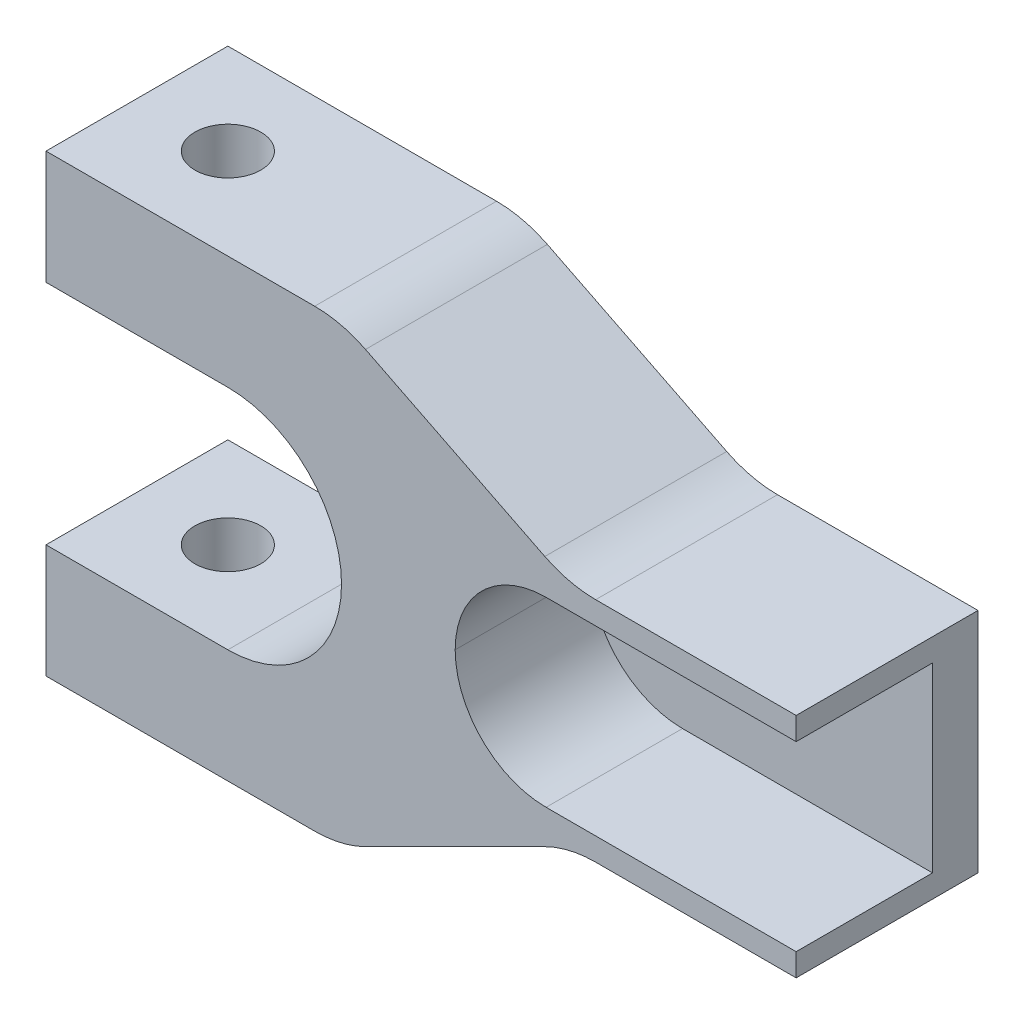
ISO-10303-21;
HEADER;
FILE_DESCRIPTION(('STEP AP214'),'2;1');
FILE_NAME('part.step','',(''),(''),'','','');
FILE_SCHEMA(('AUTOMOTIVE_DESIGN { 1 0 10303 214 1 1 1 1 }'));
ENDSEC;
DATA;
#1=APPLICATION_CONTEXT('core data for automotive mechanical design processes');
#2=APPLICATION_PROTOCOL_DEFINITION('international standard','automotive_design',2000,#1);
#3=PRODUCT_CONTEXT('',#1,'mechanical');
#4=PRODUCT('Part','Part','',(#3));
#5=PRODUCT_RELATED_PRODUCT_CATEGORY('part','',(#4));
#6=PRODUCT_DEFINITION_FORMATION('','',#4);
#7=PRODUCT_DEFINITION_CONTEXT('part definition',#1,'design');
#8=PRODUCT_DEFINITION('design','',#6,#7);
#9=PRODUCT_DEFINITION_SHAPE('','',#8);
#10=(LENGTH_UNIT() NAMED_UNIT(*) SI_UNIT(.MILLI.,.METRE.));
#11=(NAMED_UNIT(*) PLANE_ANGLE_UNIT() SI_UNIT($,.RADIAN.));
#12=(NAMED_UNIT(*) SI_UNIT($,.STERADIAN.) SOLID_ANGLE_UNIT());
#13=UNCERTAINTY_MEASURE_WITH_UNIT(LENGTH_MEASURE(1.E-05),#10,'distance_accuracy_value','');
#14=(GEOMETRIC_REPRESENTATION_CONTEXT(3) GLOBAL_UNCERTAINTY_ASSIGNED_CONTEXT((#13)) GLOBAL_UNIT_ASSIGNED_CONTEXT((#10,
#11,#12)) REPRESENTATION_CONTEXT('',''));
#15=CARTESIAN_POINT('',(0.,0.,0.));
#16=DIRECTION('',(0.,0.,1.));
#17=DIRECTION('',(1.,0.,0.));
#18=AXIS2_PLACEMENT_3D('',#15,#16,#17);
#19=CARTESIAN_POINT('',(-18.,5.,-4.));
#20=DIRECTION('',(-1.,0.,0.));
#21=DIRECTION('',(0.,-1.,0.));
#22=AXIS2_PLACEMENT_3D('',#19,#20,#21);
#23=PLANE('',#22);
#24=DIRECTION('',(0.,-1.,0.));
#25=VECTOR('',#24,1.);
#26=CARTESIAN_POINT('',(-18.,5.,4.));
#27=LINE('',#26,#25);
#28=CARTESIAN_POINT('',(-18.,10.,4.));
#29=VERTEX_POINT('',#28);
#30=CARTESIAN_POINT('',(-18.,5.,4.));
#31=VERTEX_POINT('',#30);
#32=EDGE_CURVE('E399',#29,#31,#27,.T.);
#33=ORIENTED_EDGE('',*,*,#32,.F.);
#34=DIRECTION('',(0.,0.,1.));
#35=VECTOR('',#34,1.);
#36=CARTESIAN_POINT('',(-18.,10.,-4.));
#37=LINE('',#36,#35);
#38=CARTESIAN_POINT('',(-18.,10.,-4.));
#39=VERTEX_POINT('',#38);
#40=EDGE_CURVE('E239',#39,#29,#37,.T.);
#41=ORIENTED_EDGE('',*,*,#40,.F.);
#42=DIRECTION('',(0.,-1.,0.));
#43=VECTOR('',#42,1.);
#44=CARTESIAN_POINT('',(-18.,5.,-4.));
#45=LINE('',#44,#43);
#46=CARTESIAN_POINT('',(-18.,5.,-4.));
#47=VERTEX_POINT('',#46);
#48=EDGE_CURVE('E238',#39,#47,#45,.T.);
#49=ORIENTED_EDGE('',*,*,#48,.T.);
#50=DIRECTION('',(0.,0.,1.));
#51=VECTOR('',#50,1.);
#52=CARTESIAN_POINT('',(-18.,5.,-4.));
#53=LINE('',#52,#51);
#54=EDGE_CURVE('E258',#47,#31,#53,.T.);
#55=ORIENTED_EDGE('',*,*,#54,.T.);
#56=EDGE_LOOP('',(#33,#41,#49,#55));
#57=FACE_BOUND('',#56,.T.);
#58=ADVANCED_FACE('F39',(#57),#23,.T.);
#59=CARTESIAN_POINT('',(-5.,10.,-4.));
#60=DIRECTION('',(0.,1.,0.));
#61=DIRECTION('',(-1.,0.,0.));
#62=AXIS2_PLACEMENT_3D('',#59,#60,#61);
#63=PLANE('',#62);
#64=CARTESIAN_POINT('',(-14.,10.,0.));
#65=DIRECTION('',(0.,1.,0.));
#66=DIRECTION('',(-1.,0.,0.));
#67=AXIS2_PLACEMENT_3D('',#64,#65,#66);
#68=CIRCLE('',#67,1.45);
#69=CARTESIAN_POINT('',(-15.45,10.,0.));
#70=VERTEX_POINT('',#69);
#71=EDGE_CURVE('E446',#70,#70,#68,.T.);
#72=ORIENTED_EDGE('',*,*,#71,.F.);
#73=EDGE_LOOP('',(#72));
#74=FACE_BOUND('',#73,.T.);
#75=DIRECTION('',(-1.,0.,0.));
#76=VECTOR('',#75,1.);
#77=CARTESIAN_POINT('',(-5.,10.,4.));
#78=LINE('',#77,#76);
#79=CARTESIAN_POINT('',(-6.18033988749895,10.,4.));
#80=VERTEX_POINT('',#79);
#81=EDGE_CURVE('E235',#80,#29,#78,.T.);
#82=ORIENTED_EDGE('',*,*,#81,.F.);
#83=DIRECTION('',(0.,0.,1.));
#84=VECTOR('',#83,1.);
#85=CARTESIAN_POINT('',(-6.18033988749895,10.,-4.));
#86=LINE('',#85,#84);
#87=CARTESIAN_POINT('',(-6.18033988749895,10.,-4.));
#88=VERTEX_POINT('',#87);
#89=EDGE_CURVE('E328',#80,#88,#86,.F.);
#90=ORIENTED_EDGE('',*,*,#89,.T.);
#91=DIRECTION('',(-1.,0.,0.));
#92=VECTOR('',#91,1.);
#93=CARTESIAN_POINT('',(-5.,10.,-4.));
#94=LINE('',#93,#92);
#95=EDGE_CURVE('E261',#88,#39,#94,.T.);
#96=ORIENTED_EDGE('',*,*,#95,.T.);
#97=ORIENTED_EDGE('',*,*,#40,.T.);
#98=EDGE_LOOP('',(#82,#90,#96,#97));
#99=FACE_BOUND('',#98,.T.);
#100=ADVANCED_FACE('F547',(#74,#99),#63,.T.);
#101=CARTESIAN_POINT('',(5.,5.,-4.));
#102=DIRECTION('',(0.447213595499958,0.894427190999916,0.));
#103=DIRECTION('',(-0.894427190999916,0.447213595499958,0.));
#104=AXIS2_PLACEMENT_3D('',#101,#102,#103);
#105=PLANE('',#104);
#106=DIRECTION('',(-0.894427190999916,0.447213595499958,0.));
#107=VECTOR('',#106,1.);
#108=CARTESIAN_POINT('',(5.,5.,-4.));
#109=LINE('',#108,#107);
#110=CARTESIAN_POINT('',(3.94427190999916,5.52786404500042,-4.));
#111=VERTEX_POINT('',#110);
#112=CARTESIAN_POINT('',(-3.94427190999916,9.47213595499958,-4.));
#113=VERTEX_POINT('',#112);
#114=EDGE_CURVE('E393',#111,#113,#109,.T.);
#115=ORIENTED_EDGE('',*,*,#114,.T.);
#116=DIRECTION('',(0.,0.,1.));
#117=VECTOR('',#116,1.);
#118=CARTESIAN_POINT('',(-3.94427190999916,9.47213595499958,-4.));
#119=LINE('',#118,#117);
#120=CARTESIAN_POINT('',(-3.94427190999916,9.47213595499958,4.));
#121=VERTEX_POINT('',#120);
#122=EDGE_CURVE('E318',#113,#121,#119,.T.);
#123=ORIENTED_EDGE('',*,*,#122,.T.);
#124=DIRECTION('',(-0.894427190999916,0.447213595499958,0.));
#125=VECTOR('',#124,1.);
#126=CARTESIAN_POINT('',(5.,5.,4.));
#127=LINE('',#126,#125);
#128=CARTESIAN_POINT('',(3.94427190999916,5.52786404500042,4.));
#129=VERTEX_POINT('',#128);
#130=EDGE_CURVE('E228',#129,#121,#127,.T.);
#131=ORIENTED_EDGE('',*,*,#130,.F.);
#132=DIRECTION('',(0.,0.,1.));
#133=VECTOR('',#132,1.);
#134=CARTESIAN_POINT('',(3.94427190999916,5.52786404500042,-4.));
#135=LINE('',#134,#133);
#136=EDGE_CURVE('E309',#129,#111,#135,.F.);
#137=ORIENTED_EDGE('',*,*,#136,.T.);
#138=EDGE_LOOP('',(#115,#123,#131,#137));
#139=FACE_BOUND('',#138,.T.);
#140=ADVANCED_FACE('F509',(#139),#105,.T.);
#141=CARTESIAN_POINT('',(15.,5.,-4.));
#142=DIRECTION('',(0.,1.,0.));
#143=DIRECTION('',(-1.,0.,0.));
#144=AXIS2_PLACEMENT_3D('',#141,#142,#143);
#145=PLANE('',#144);
#146=DIRECTION('',(-1.,0.,0.));
#147=VECTOR('',#146,1.);
#148=CARTESIAN_POINT('',(15.,5.,-4.));
#149=LINE('',#148,#147);
#150=CARTESIAN_POINT('',(15.,5.,-4.));
#151=VERTEX_POINT('',#150);
#152=CARTESIAN_POINT('',(6.18033988749895,5.,-4.));
#153=VERTEX_POINT('',#152);
#154=EDGE_CURVE('E389',#151,#153,#149,.T.);
#155=ORIENTED_EDGE('',*,*,#154,.T.);
#156=DIRECTION('',(0.,0.,1.));
#157=VECTOR('',#156,1.);
#158=CARTESIAN_POINT('',(6.18033988749895,5.,4.));
#159=LINE('',#158,#157);
#160=CARTESIAN_POINT('',(6.18033988749895,5.,4.));
#161=VERTEX_POINT('',#160);
#162=EDGE_CURVE('E336',#153,#161,#159,.T.);
#163=ORIENTED_EDGE('',*,*,#162,.T.);
#164=DIRECTION('',(-1.,0.,0.));
#165=VECTOR('',#164,1.);
#166=CARTESIAN_POINT('',(15.,5.,4.));
#167=LINE('',#166,#165);
#168=CARTESIAN_POINT('',(15.,5.,4.));
#169=VERTEX_POINT('',#168);
#170=EDGE_CURVE('E222',#169,#161,#167,.T.);
#171=ORIENTED_EDGE('',*,*,#170,.F.);
#172=DIRECTION('',(0.,0.,1.));
#173=VECTOR('',#172,1.);
#174=CARTESIAN_POINT('',(15.,5.,-4.));
#175=LINE('',#174,#173);
#176=EDGE_CURVE('E244',#151,#169,#175,.T.);
#177=ORIENTED_EDGE('',*,*,#176,.F.);
#178=EDGE_LOOP('',(#155,#163,#171,#177));
#179=FACE_BOUND('',#178,.T.);
#180=ADVANCED_FACE('F517',(#179),#145,.T.);
#181=CARTESIAN_POINT('',(15.,5.,-4.));
#182=DIRECTION('',(1.,0.,0.));
#183=DIRECTION('',(0.,0.,-1.));
#184=AXIS2_PLACEMENT_3D('',#181,#182,#183);
#185=PLANE('',#184);
#186=DIRECTION('',(0.,0.,1.));
#187=VECTOR('',#186,1.);
#188=CARTESIAN_POINT('',(15.,4.,4.));
#189=LINE('',#188,#187);
#190=CARTESIAN_POINT('',(15.,4.,-2.));
#191=VERTEX_POINT('',#190);
#192=CARTESIAN_POINT('',(15.,4.,4.));
#193=VERTEX_POINT('',#192);
#194=EDGE_CURVE('E203',#191,#193,#189,.T.);
#195=ORIENTED_EDGE('',*,*,#194,.F.);
#196=DIRECTION('',(0.,1.,0.));
#197=VECTOR('',#196,1.);
#198=CARTESIAN_POINT('',(15.,4.,-2.));
#199=LINE('',#198,#197);
#200=CARTESIAN_POINT('',(15.,-4.,-2.));
#201=VERTEX_POINT('',#200);
#202=EDGE_CURVE('E212',#201,#191,#199,.T.);
#203=ORIENTED_EDGE('',*,*,#202,.F.);
#204=DIRECTION('',(0.,0.,-1.));
#205=VECTOR('',#204,1.);
#206=CARTESIAN_POINT('',(15.,-4.,4.));
#207=LINE('',#206,#205);
#208=CARTESIAN_POINT('',(15.,-4.,4.));
#209=VERTEX_POINT('',#208);
#210=EDGE_CURVE('E195',#209,#201,#207,.T.);
#211=ORIENTED_EDGE('',*,*,#210,.F.);
#212=DIRECTION('',(0.,1.,0.));
#213=VECTOR('',#212,1.);
#214=CARTESIAN_POINT('',(15.,5.,4.));
#215=LINE('',#214,#213);
#216=CARTESIAN_POINT('',(15.,-5.,4.));
#217=VERTEX_POINT('',#216);
#218=EDGE_CURVE('E210',#217,#209,#215,.T.);
#219=ORIENTED_EDGE('',*,*,#218,.F.);
#220=DIRECTION('',(0.,0.,1.));
#221=VECTOR('',#220,1.);
#222=CARTESIAN_POINT('',(15.,-5.,-4.));
#223=LINE('',#222,#221);
#224=CARTESIAN_POINT('',(15.,-5.,-4.));
#225=VERTEX_POINT('',#224);
#226=EDGE_CURVE('E248',#225,#217,#223,.T.);
#227=ORIENTED_EDGE('',*,*,#226,.F.);
#228=DIRECTION('',(0.,1.,0.));
#229=VECTOR('',#228,1.);
#230=CARTESIAN_POINT('',(15.,5.,-4.));
#231=LINE('',#230,#229);
#232=EDGE_CURVE('E380',#225,#151,#231,.T.);
#233=ORIENTED_EDGE('',*,*,#232,.T.);
#234=ORIENTED_EDGE('',*,*,#176,.T.);
#235=EDGE_CURVE('E223',#193,#169,#215,.T.);
#236=ORIENTED_EDGE('',*,*,#235,.F.);
#237=EDGE_LOOP('',(#195,#203,#211,#219,#227,#233,#234,#236));
#238=FACE_BOUND('',#237,.T.);
#239=ADVANCED_FACE('F208',(#238),#185,.T.);
#240=CARTESIAN_POINT('',(5.,-5.,-4.));
#241=DIRECTION('',(0.,-1.,0.));
#242=DIRECTION('',(0.,0.,-1.));
#243=AXIS2_PLACEMENT_3D('',#240,#241,#242);
#244=PLANE('',#243);
#245=DIRECTION('',(1.,0.,0.));
#246=VECTOR('',#245,1.);
#247=CARTESIAN_POINT('',(5.,-5.,4.));
#248=LINE('',#247,#246);
#249=CARTESIAN_POINT('',(6.18033988749895,-5.,4.));
#250=VERTEX_POINT('',#249);
#251=EDGE_CURVE('E219',#250,#217,#248,.T.);
#252=ORIENTED_EDGE('',*,*,#251,.F.);
#253=DIRECTION('',(0.,0.,1.));
#254=VECTOR('',#253,1.);
#255=CARTESIAN_POINT('',(6.18033988749895,-5.,-4.));
#256=LINE('',#255,#254);
#257=CARTESIAN_POINT('',(6.18033988749895,-5.,-4.));
#258=VERTEX_POINT('',#257);
#259=EDGE_CURVE('E351',#250,#258,#256,.F.);
#260=ORIENTED_EDGE('',*,*,#259,.T.);
#261=DIRECTION('',(1.,0.,0.));
#262=VECTOR('',#261,1.);
#263=CARTESIAN_POINT('',(5.,-5.,-4.));
#264=LINE('',#263,#262);
#265=EDGE_CURVE('E375',#258,#225,#264,.T.);
#266=ORIENTED_EDGE('',*,*,#265,.T.);
#267=ORIENTED_EDGE('',*,*,#226,.T.);
#268=EDGE_LOOP('',(#252,#260,#266,#267));
#269=FACE_BOUND('',#268,.T.);
#270=ADVANCED_FACE('F368',(#269),#244,.T.);
#271=CARTESIAN_POINT('',(5.,-5.,-4.));
#272=DIRECTION('',(0.447213595499958,-0.894427190999916,0.));
#273=DIRECTION('',(0.894427190999916,0.447213595499958,0.));
#274=AXIS2_PLACEMENT_3D('',#271,#272,#273);
#275=PLANE('',#274);
#276=DIRECTION('',(0.894427190999916,0.447213595499958,0.));
#277=VECTOR('',#276,1.);
#278=CARTESIAN_POINT('',(5.,-5.,4.));
#279=LINE('',#278,#277);
#280=CARTESIAN_POINT('',(-3.94427190999916,-9.47213595499958,4.));
#281=VERTEX_POINT('',#280);
#282=CARTESIAN_POINT('',(3.94427190999916,-5.52786404500042,4.));
#283=VERTEX_POINT('',#282);
#284=EDGE_CURVE('E363',#281,#283,#279,.T.);
#285=ORIENTED_EDGE('',*,*,#284,.F.);
#286=DIRECTION('',(0.,0.,1.));
#287=VECTOR('',#286,1.);
#288=CARTESIAN_POINT('',(-3.94427190999916,-9.47213595499958,-4.));
#289=LINE('',#288,#287);
#290=CARTESIAN_POINT('',(-3.94427190999916,-9.47213595499958,-4.));
#291=VERTEX_POINT('',#290);
#292=EDGE_CURVE('E348',#281,#291,#289,.F.);
#293=ORIENTED_EDGE('',*,*,#292,.T.);
#294=DIRECTION('',(0.894427190999916,0.447213595499958,0.));
#295=VECTOR('',#294,1.);
#296=CARTESIAN_POINT('',(5.,-5.,-4.));
#297=LINE('',#296,#295);
#298=CARTESIAN_POINT('',(3.94427190999916,-5.52786404500042,-4.));
#299=VERTEX_POINT('',#298);
#300=EDGE_CURVE('E373',#291,#299,#297,.T.);
#301=ORIENTED_EDGE('',*,*,#300,.T.);
#302=DIRECTION('',(0.,0.,1.));
#303=VECTOR('',#302,1.);
#304=CARTESIAN_POINT('',(3.94427190999916,-5.52786404500042,4.));
#305=LINE('',#304,#303);
#306=EDGE_CURVE('E344',#299,#283,#305,.T.);
#307=ORIENTED_EDGE('',*,*,#306,.T.);
#308=EDGE_LOOP('',(#285,#293,#301,#307));
#309=FACE_BOUND('',#308,.T.);
#310=ADVANCED_FACE('F371',(#309),#275,.T.);
#311=CARTESIAN_POINT('',(-5.,-10.,-4.));
#312=DIRECTION('',(0.,-1.,0.));
#313=DIRECTION('',(1.,0.,0.));
#314=AXIS2_PLACEMENT_3D('',#311,#312,#313);
#315=PLANE('',#314);
#316=CARTESIAN_POINT('',(-14.,-10.,0.));
#317=DIRECTION('',(0.,1.,0.));
#318=DIRECTION('',(-1.,0.,0.));
#319=AXIS2_PLACEMENT_3D('',#316,#317,#318);
#320=CIRCLE('',#319,1.45);
#321=CARTESIAN_POINT('',(-15.45,-10.,0.));
#322=VERTEX_POINT('',#321);
#323=EDGE_CURVE('E443',#322,#322,#320,.T.);
#324=ORIENTED_EDGE('',*,*,#323,.T.);
#325=EDGE_LOOP('',(#324));
#326=FACE_BOUND('',#325,.T.);
#327=DIRECTION('',(1.,0.,0.));
#328=VECTOR('',#327,1.);
#329=CARTESIAN_POINT('',(-5.,-10.,-4.));
#330=LINE('',#329,#328);
#331=CARTESIAN_POINT('',(-18.,-10.,-4.));
#332=VERTEX_POINT('',#331);
#333=CARTESIAN_POINT('',(-6.18033988749895,-10.,-4.));
#334=VERTEX_POINT('',#333);
#335=EDGE_CURVE('E376',#332,#334,#330,.T.);
#336=ORIENTED_EDGE('',*,*,#335,.T.);
#337=DIRECTION('',(0.,0.,1.));
#338=VECTOR('',#337,1.);
#339=CARTESIAN_POINT('',(-6.18033988749895,-10.,-4.));
#340=LINE('',#339,#338);
#341=CARTESIAN_POINT('',(-6.18033988749895,-10.,4.));
#342=VERTEX_POINT('',#341);
#343=EDGE_CURVE('E340',#334,#342,#340,.T.);
#344=ORIENTED_EDGE('',*,*,#343,.T.);
#345=DIRECTION('',(1.,0.,0.));
#346=VECTOR('',#345,1.);
#347=CARTESIAN_POINT('',(-5.,-10.,4.));
#348=LINE('',#347,#346);
#349=CARTESIAN_POINT('',(-18.,-10.,4.));
#350=VERTEX_POINT('',#349);
#351=EDGE_CURVE('E415',#350,#342,#348,.T.);
#352=ORIENTED_EDGE('',*,*,#351,.F.);
#353=DIRECTION('',(0.,0.,1.));
#354=VECTOR('',#353,1.);
#355=CARTESIAN_POINT('',(-18.,-10.,-4.));
#356=LINE('',#355,#354);
#357=EDGE_CURVE('E251',#332,#350,#356,.T.);
#358=ORIENTED_EDGE('',*,*,#357,.F.);
#359=EDGE_LOOP('',(#336,#344,#352,#358));
#360=FACE_BOUND('',#359,.T.);
#361=ADVANCED_FACE('F476',(#326,#360),#315,.T.);
#362=CARTESIAN_POINT('',(-18.,-10.,-4.));
#363=DIRECTION('',(-1.,0.,0.));
#364=DIRECTION('',(0.,0.,1.));
#365=AXIS2_PLACEMENT_3D('',#362,#363,#364);
#366=PLANE('',#365);
#367=DIRECTION('',(0.,-1.,0.));
#368=VECTOR('',#367,1.);
#369=CARTESIAN_POINT('',(-18.,-10.,4.));
#370=LINE('',#369,#368);
#371=CARTESIAN_POINT('',(-18.,-5.,4.));
#372=VERTEX_POINT('',#371);
#373=EDGE_CURVE('E411',#372,#350,#370,.T.);
#374=ORIENTED_EDGE('',*,*,#373,.F.);
#375=DIRECTION('',(0.,0.,1.));
#376=VECTOR('',#375,1.);
#377=CARTESIAN_POINT('',(-18.,-5.,-4.));
#378=LINE('',#377,#376);
#379=CARTESIAN_POINT('',(-18.,-5.,-4.));
#380=VERTEX_POINT('',#379);
#381=EDGE_CURVE('E254',#380,#372,#378,.T.);
#382=ORIENTED_EDGE('',*,*,#381,.F.);
#383=DIRECTION('',(0.,-1.,0.));
#384=VECTOR('',#383,1.);
#385=CARTESIAN_POINT('',(-18.,-10.,-4.));
#386=LINE('',#385,#384);
#387=EDGE_CURVE('E382',#380,#332,#386,.T.);
#388=ORIENTED_EDGE('',*,*,#387,.T.);
#389=ORIENTED_EDGE('',*,*,#357,.T.);
#390=EDGE_LOOP('',(#374,#382,#388,#389));
#391=FACE_BOUND('',#390,.T.);
#392=ADVANCED_FACE('F468',(#391),#366,.T.);
#393=CARTESIAN_POINT('',(-18.,-5.,-4.));
#394=DIRECTION('',(0.,1.,0.));
#395=DIRECTION('',(0.,0.,1.));
#396=AXIS2_PLACEMENT_3D('',#393,#394,#395);
#397=PLANE('',#396);
#398=CARTESIAN_POINT('',(-14.,-5.,0.));
#399=DIRECTION('',(0.,1.,0.));
#400=DIRECTION('',(0.,0.,1.));
#401=AXIS2_PLACEMENT_3D('',#398,#399,#400);
#402=CIRCLE('',#401,1.45);
#403=CARTESIAN_POINT('',(-15.45,-5.,0.));
#404=VERTEX_POINT('',#403);
#405=EDGE_CURVE('E315',#404,#404,#402,.T.);
#406=ORIENTED_EDGE('',*,*,#405,.F.);
#407=EDGE_LOOP('',(#406));
#408=FACE_BOUND('',#407,.T.);
#409=DIRECTION('',(-1.,0.,0.));
#410=VECTOR('',#409,1.);
#411=CARTESIAN_POINT('',(-18.,-5.,4.));
#412=LINE('',#411,#410);
#413=CARTESIAN_POINT('',(-10.,-5.,4.));
#414=VERTEX_POINT('',#413);
#415=EDGE_CURVE('E408',#414,#372,#412,.T.);
#416=ORIENTED_EDGE('',*,*,#415,.F.);
#417=DIRECTION('',(0.,0.,1.));
#418=VECTOR('',#417,1.);
#419=CARTESIAN_POINT('',(-10.,-5.,-4.));
#420=LINE('',#419,#418);
#421=CARTESIAN_POINT('',(-10.,-5.,-4.));
#422=VERTEX_POINT('',#421);
#423=EDGE_CURVE('E294',#414,#422,#420,.F.);
#424=ORIENTED_EDGE('',*,*,#423,.T.);
#425=DIRECTION('',(-1.,0.,0.));
#426=VECTOR('',#425,1.);
#427=CARTESIAN_POINT('',(-18.,-5.,-4.));
#428=LINE('',#427,#426);
#429=EDGE_CURVE('E460',#422,#380,#428,.T.);
#430=ORIENTED_EDGE('',*,*,#429,.T.);
#431=ORIENTED_EDGE('',*,*,#381,.T.);
#432=EDGE_LOOP('',(#416,#424,#430,#431));
#433=FACE_BOUND('',#432,.T.);
#434=ADVANCED_FACE('F483',(#408,#433),#397,.T.);
#435=CARTESIAN_POINT('',(-5.,5.,-4.));
#436=DIRECTION('',(0.,-1.,0.));
#437=DIRECTION('',(1.,0.,0.));
#438=AXIS2_PLACEMENT_3D('',#435,#436,#437);
#439=PLANE('',#438);
#440=CARTESIAN_POINT('',(-14.,5.,0.));
#441=DIRECTION('',(0.,-1.,0.));
#442=DIRECTION('',(1.,0.,0.));
#443=AXIS2_PLACEMENT_3D('',#440,#441,#442);
#444=CIRCLE('',#443,1.45);
#445=CARTESIAN_POINT('',(-15.45,5.,0.));
#446=VERTEX_POINT('',#445);
#447=EDGE_CURVE('E43',#446,#446,#444,.T.);
#448=ORIENTED_EDGE('',*,*,#447,.F.);
#449=EDGE_LOOP('',(#448));
#450=FACE_BOUND('',#449,.T.);
#451=DIRECTION('',(1.,0.,0.));
#452=VECTOR('',#451,1.);
#453=CARTESIAN_POINT('',(-5.,5.,-4.));
#454=LINE('',#453,#452);
#455=CARTESIAN_POINT('',(-10.,5.,-4.));
#456=VERTEX_POINT('',#455);
#457=EDGE_CURVE('E456',#47,#456,#454,.T.);
#458=ORIENTED_EDGE('',*,*,#457,.T.);
#459=DIRECTION('',(0.,0.,1.));
#460=VECTOR('',#459,1.);
#461=CARTESIAN_POINT('',(-10.,5.,4.));
#462=LINE('',#461,#460);
#463=CARTESIAN_POINT('',(-10.,5.,4.));
#464=VERTEX_POINT('',#463);
#465=EDGE_CURVE('E278',#456,#464,#462,.T.);
#466=ORIENTED_EDGE('',*,*,#465,.T.);
#467=DIRECTION('',(1.,0.,0.));
#468=VECTOR('',#467,1.);
#469=CARTESIAN_POINT('',(-5.,5.,4.));
#470=LINE('',#469,#468);
#471=EDGE_CURVE('E403',#31,#464,#470,.T.);
#472=ORIENTED_EDGE('',*,*,#471,.F.);
#473=ORIENTED_EDGE('',*,*,#54,.F.);
#474=EDGE_LOOP('',(#458,#466,#472,#473));
#475=FACE_BOUND('',#474,.T.);
#476=ADVANCED_FACE('F493',(#450,#475),#439,.T.);
#477=CARTESIAN_POINT('',(0.,0.,-4.));
#478=DIRECTION('',(0.,0.,1.));
#479=DIRECTION('',(1.,0.,0.));
#480=AXIS2_PLACEMENT_3D('',#477,#478,#479);
#481=PLANE('',#480);
#482=CARTESIAN_POINT('',(4.,0.,-4.));
#483=DIRECTION('',(0.,0.,-1.));
#484=DIRECTION('',(-1.,0.,0.));
#485=AXIS2_PLACEMENT_3D('',#482,#483,#484);
#486=CIRCLE('',#485,1.25);
#487=CARTESIAN_POINT('',(2.75,0.,-4.));
#488=VERTEX_POINT('',#487);
#489=EDGE_CURVE('E287',#488,#488,#486,.T.);
#490=ORIENTED_EDGE('',*,*,#489,.F.);
#491=EDGE_LOOP('',(#490));
#492=FACE_BOUND('',#491,.T.);
#493=CARTESIAN_POINT('',(8.,0.,-4.));
#494=DIRECTION('',(0.,0.,-1.));
#495=DIRECTION('',(-1.,0.,0.));
#496=AXIS2_PLACEMENT_3D('',#493,#494,#495);
#497=CIRCLE('',#496,1.25);
#498=CARTESIAN_POINT('',(6.75,0.,-4.));
#499=VERTEX_POINT('',#498);
#500=EDGE_CURVE('E314',#499,#499,#497,.T.);
#501=ORIENTED_EDGE('',*,*,#500,.F.);
#502=EDGE_LOOP('',(#501));
#503=FACE_BOUND('',#502,.T.);
#504=ORIENTED_EDGE('',*,*,#95,.F.);
#505=CARTESIAN_POINT('',(-6.18033988749895,5.,-4.));
#506=DIRECTION('',(0.,0.,1.));
#507=DIRECTION('',(1.,0.,0.));
#508=AXIS2_PLACEMENT_3D('',#505,#506,#507);
#509=CIRCLE('',#508,5.);
#510=EDGE_CURVE('E333',#88,#113,#509,.F.);
#511=ORIENTED_EDGE('',*,*,#510,.T.);
#512=ORIENTED_EDGE('',*,*,#114,.F.);
#513=CARTESIAN_POINT('',(6.18033988749895,10.,-4.));
#514=DIRECTION('',(0.,0.,1.));
#515=DIRECTION('',(1.,0.,0.));
#516=AXIS2_PLACEMENT_3D('',#513,#514,#515);
#517=CIRCLE('',#516,5.);
#518=EDGE_CURVE('E357',#111,#153,#517,.T.);
#519=ORIENTED_EDGE('',*,*,#518,.T.);
#520=ORIENTED_EDGE('',*,*,#154,.F.);
#521=ORIENTED_EDGE('',*,*,#232,.F.);
#522=ORIENTED_EDGE('',*,*,#265,.F.);
#523=CARTESIAN_POINT('',(6.18033988749895,-10.,-4.));
#524=DIRECTION('',(0.,0.,1.));
#525=DIRECTION('',(1.,0.,0.));
#526=AXIS2_PLACEMENT_3D('',#523,#524,#525);
#527=CIRCLE('',#526,5.);
#528=EDGE_CURVE('E11',#258,#299,#527,.T.);
#529=ORIENTED_EDGE('',*,*,#528,.T.);
#530=ORIENTED_EDGE('',*,*,#300,.F.);
#531=CARTESIAN_POINT('',(-6.18033988749895,-5.,-4.));
#532=DIRECTION('',(0.,0.,1.));
#533=DIRECTION('',(1.,0.,0.));
#534=AXIS2_PLACEMENT_3D('',#531,#532,#533);
#535=CIRCLE('',#534,5.);
#536=EDGE_CURVE('E56',#291,#334,#535,.F.);
#537=ORIENTED_EDGE('',*,*,#536,.T.);
#538=ORIENTED_EDGE('',*,*,#335,.F.);
#539=ORIENTED_EDGE('',*,*,#387,.F.);
#540=ORIENTED_EDGE('',*,*,#429,.F.);
#541=CARTESIAN_POINT('',(-10.,0.,-4.));
#542=DIRECTION('',(0.,0.,1.));
#543=DIRECTION('',(1.,0.,0.));
#544=AXIS2_PLACEMENT_3D('',#541,#542,#543);
#545=CIRCLE('',#544,5.);
#546=CARTESIAN_POINT('',(-5.,0.,-4.));
#547=VERTEX_POINT('',#546);
#548=EDGE_CURVE('E306',#422,#547,#545,.T.);
#549=ORIENTED_EDGE('',*,*,#548,.T.);
#550=CARTESIAN_POINT('',(-10.,0.,-4.));
#551=DIRECTION('',(0.,0.,1.));
#552=DIRECTION('',(1.,0.,0.));
#553=AXIS2_PLACEMENT_3D('',#550,#551,#552);
#554=CIRCLE('',#553,5.);
#555=EDGE_CURVE('E300',#547,#456,#554,.T.);
#556=ORIENTED_EDGE('',*,*,#555,.T.);
#557=ORIENTED_EDGE('',*,*,#457,.F.);
#558=ORIENTED_EDGE('',*,*,#48,.F.);
#559=EDGE_LOOP('',(#504,#511,#512,#519,#520,#521,#522,#529,#530,#537,#538,#539,#540,#549,#556,
#557,#558));
#560=FACE_BOUND('',#559,.T.);
#561=ADVANCED_FACE('F472',(#492,#503,#560),#481,.F.);
#562=CARTESIAN_POINT('',(0.,0.,4.));
#563=DIRECTION('',(0.,0.,1.));
#564=DIRECTION('',(1.,0.,0.));
#565=AXIS2_PLACEMENT_3D('',#562,#563,#564);
#566=PLANE('',#565);
#567=ORIENTED_EDGE('',*,*,#130,.T.);
#568=CARTESIAN_POINT('',(-6.18033988749895,5.,4.));
#569=DIRECTION('',(0.,0.,1.));
#570=DIRECTION('',(1.,0.,0.));
#571=AXIS2_PLACEMENT_3D('',#568,#569,#570);
#572=CIRCLE('',#571,5.);
#573=EDGE_CURVE('E325',#121,#80,#572,.T.);
#574=ORIENTED_EDGE('',*,*,#573,.T.);
#575=ORIENTED_EDGE('',*,*,#81,.T.);
#576=ORIENTED_EDGE('',*,*,#32,.T.);
#577=ORIENTED_EDGE('',*,*,#471,.T.);
#578=CARTESIAN_POINT('',(-10.,0.,4.));
#579=DIRECTION('',(0.,0.,1.));
#580=DIRECTION('',(1.,0.,0.));
#581=AXIS2_PLACEMENT_3D('',#578,#579,#580);
#582=CIRCLE('',#581,5.);
#583=CARTESIAN_POINT('',(-5.,0.,4.));
#584=VERTEX_POINT('',#583);
#585=EDGE_CURVE('E297',#464,#584,#582,.F.);
#586=ORIENTED_EDGE('',*,*,#585,.T.);
#587=CARTESIAN_POINT('',(-10.,0.,4.));
#588=DIRECTION('',(0.,0.,1.));
#589=DIRECTION('',(1.,0.,0.));
#590=AXIS2_PLACEMENT_3D('',#587,#588,#589);
#591=CIRCLE('',#590,5.);
#592=EDGE_CURVE('E303',#584,#414,#591,.F.);
#593=ORIENTED_EDGE('',*,*,#592,.T.);
#594=ORIENTED_EDGE('',*,*,#415,.T.);
#595=ORIENTED_EDGE('',*,*,#373,.T.);
#596=ORIENTED_EDGE('',*,*,#351,.T.);
#597=CARTESIAN_POINT('',(-6.18033988749895,-5.,4.));
#598=DIRECTION('',(0.,0.,1.));
#599=DIRECTION('',(1.,0.,0.));
#600=AXIS2_PLACEMENT_3D('',#597,#598,#599);
#601=CIRCLE('',#600,5.);
#602=EDGE_CURVE('E322',#342,#281,#601,.T.);
#603=ORIENTED_EDGE('',*,*,#602,.T.);
#604=ORIENTED_EDGE('',*,*,#284,.T.);
#605=CARTESIAN_POINT('',(6.18033988749895,-10.,4.));
#606=DIRECTION('',(0.,0.,1.));
#607=DIRECTION('',(1.,0.,0.));
#608=AXIS2_PLACEMENT_3D('',#605,#606,#607);
#609=CIRCLE('',#608,5.);
#610=EDGE_CURVE('E49',#283,#250,#609,.F.);
#611=ORIENTED_EDGE('',*,*,#610,.T.);
#612=ORIENTED_EDGE('',*,*,#251,.T.);
#613=ORIENTED_EDGE('',*,*,#218,.T.);
#614=DIRECTION('',(1.,0.,0.));
#615=VECTOR('',#614,1.);
#616=CARTESIAN_POINT('',(0.,-4.,4.));
#617=LINE('',#616,#615);
#618=CARTESIAN_POINT('',(4.,-4.,4.));
#619=VERTEX_POINT('',#618);
#620=EDGE_CURVE('E191',#619,#209,#617,.T.);
#621=ORIENTED_EDGE('',*,*,#620,.F.);
#622=CARTESIAN_POINT('',(4.,0.,4.));
#623=DIRECTION('',(0.,0.,1.));
#624=DIRECTION('',(1.,0.,0.));
#625=AXIS2_PLACEMENT_3D('',#622,#623,#624);
#626=CIRCLE('',#625,4.);
#627=CARTESIAN_POINT('',(0.,0.,4.));
#628=VERTEX_POINT('',#627);
#629=EDGE_CURVE('E272',#619,#628,#626,.F.);
#630=ORIENTED_EDGE('',*,*,#629,.T.);
#631=CARTESIAN_POINT('',(4.,0.,4.));
#632=DIRECTION('',(0.,0.,1.));
#633=DIRECTION('',(1.,0.,0.));
#634=AXIS2_PLACEMENT_3D('',#631,#632,#633);
#635=CIRCLE('',#634,4.);
#636=CARTESIAN_POINT('',(4.,4.,4.));
#637=VERTEX_POINT('',#636);
#638=EDGE_CURVE('E275',#628,#637,#635,.F.);
#639=ORIENTED_EDGE('',*,*,#638,.T.);
#640=DIRECTION('',(1.,0.,0.));
#641=VECTOR('',#640,1.);
#642=CARTESIAN_POINT('',(0.,4.,4.));
#643=LINE('',#642,#641);
#644=EDGE_CURVE('E404',#637,#193,#643,.T.);
#645=ORIENTED_EDGE('',*,*,#644,.T.);
#646=ORIENTED_EDGE('',*,*,#235,.T.);
#647=ORIENTED_EDGE('',*,*,#170,.T.);
#648=CARTESIAN_POINT('',(6.18033988749895,10.,4.));
#649=DIRECTION('',(0.,0.,1.));
#650=DIRECTION('',(1.,0.,0.));
#651=AXIS2_PLACEMENT_3D('',#648,#649,#650);
#652=CIRCLE('',#651,5.);
#653=EDGE_CURVE('E354',#161,#129,#652,.F.);
#654=ORIENTED_EDGE('',*,*,#653,.T.);
#655=EDGE_LOOP('',(#567,#574,#575,#576,#577,#586,#593,#594,#595,#596,#603,#604,#611,#612,#613,
#621,#630,#639,#645,#646,#647,#654));
#656=FACE_BOUND('',#655,.T.);
#657=ADVANCED_FACE('F217',(#656),#566,.T.);
#658=CARTESIAN_POINT('',(0.,4.,4.));
#659=DIRECTION('',(0.,1.,0.));
#660=DIRECTION('',(0.,0.,1.));
#661=AXIS2_PLACEMENT_3D('',#658,#659,#660);
#662=PLANE('',#661);
#663=ORIENTED_EDGE('',*,*,#644,.F.);
#664=DIRECTION('',(0.,0.,1.));
#665=VECTOR('',#664,1.);
#666=CARTESIAN_POINT('',(4.,4.,4.));
#667=LINE('',#666,#665);
#668=CARTESIAN_POINT('',(4.,4.,-2.));
#669=VERTEX_POINT('',#668);
#670=EDGE_CURVE('E269',#637,#669,#667,.F.);
#671=ORIENTED_EDGE('',*,*,#670,.T.);
#672=DIRECTION('',(1.,0.,0.));
#673=VECTOR('',#672,1.);
#674=CARTESIAN_POINT('',(0.,4.,-2.));
#675=LINE('',#674,#673);
#676=EDGE_CURVE('E421',#669,#191,#675,.T.);
#677=ORIENTED_EDGE('',*,*,#676,.T.);
#678=ORIENTED_EDGE('',*,*,#194,.T.);
#679=EDGE_LOOP('',(#663,#671,#677,#678));
#680=FACE_BOUND('',#679,.T.);
#681=ADVANCED_FACE('F525',(#680),#662,.F.);
#682=CARTESIAN_POINT('',(0.,4.,-2.));
#683=DIRECTION('',(0.,0.,-1.));
#684=DIRECTION('',(0.,1.,0.));
#685=AXIS2_PLACEMENT_3D('',#682,#683,#684);
#686=PLANE('',#685);
#687=CARTESIAN_POINT('',(4.,0.,-2.));
#688=DIRECTION('',(0.,0.,-1.));
#689=DIRECTION('',(0.,1.,0.));
#690=AXIS2_PLACEMENT_3D('',#687,#688,#689);
#691=CIRCLE('',#690,1.25);
#692=CARTESIAN_POINT('',(4.,1.25,-2.));
#693=VERTEX_POINT('',#692);
#694=EDGE_CURVE('E282',#693,#693,#691,.T.);
#695=ORIENTED_EDGE('',*,*,#694,.T.);
#696=EDGE_LOOP('',(#695));
#697=FACE_BOUND('',#696,.T.);
#698=CARTESIAN_POINT('',(8.,0.,-2.));
#699=DIRECTION('',(0.,0.,-1.));
#700=DIRECTION('',(0.,1.,0.));
#701=AXIS2_PLACEMENT_3D('',#698,#699,#700);
#702=CIRCLE('',#701,1.25);
#703=CARTESIAN_POINT('',(8.,1.24999999999997,-2.));
#704=VERTEX_POINT('',#703);
#705=EDGE_CURVE('E283',#704,#704,#702,.T.);
#706=ORIENTED_EDGE('',*,*,#705,.T.);
#707=EDGE_LOOP('',(#706));
#708=FACE_BOUND('',#707,.T.);
#709=CARTESIAN_POINT('',(4.,0.,-2.));
#710=DIRECTION('',(0.,0.,-1.));
#711=DIRECTION('',(0.,1.,0.));
#712=AXIS2_PLACEMENT_3D('',#709,#710,#711);
#713=CIRCLE('',#712,4.);
#714=CARTESIAN_POINT('',(0.,0.,-2.));
#715=VERTEX_POINT('',#714);
#716=EDGE_CURVE('E243',#669,#715,#713,.F.);
#717=ORIENTED_EDGE('',*,*,#716,.T.);
#718=CARTESIAN_POINT('',(4.,0.,-2.));
#719=DIRECTION('',(0.,0.,-1.));
#720=DIRECTION('',(0.,1.,0.));
#721=AXIS2_PLACEMENT_3D('',#718,#719,#720);
#722=CIRCLE('',#721,4.);
#723=CARTESIAN_POINT('',(4.,-4.,-2.));
#724=VERTEX_POINT('',#723);
#725=EDGE_CURVE('E264',#715,#724,#722,.F.);
#726=ORIENTED_EDGE('',*,*,#725,.T.);
#727=DIRECTION('',(1.,0.,0.));
#728=VECTOR('',#727,1.);
#729=CARTESIAN_POINT('',(0.,-4.,-2.));
#730=LINE('',#729,#728);
#731=EDGE_CURVE('E202',#724,#201,#730,.T.);
#732=ORIENTED_EDGE('',*,*,#731,.T.);
#733=ORIENTED_EDGE('',*,*,#202,.T.);
#734=ORIENTED_EDGE('',*,*,#676,.F.);
#735=EDGE_LOOP('',(#717,#726,#732,#733,#734));
#736=FACE_BOUND('',#735,.T.);
#737=ADVANCED_FACE('F529',(#697,#708,#736),#686,.F.);
#738=CARTESIAN_POINT('',(0.,-4.,4.));
#739=DIRECTION('',(0.,-1.,0.));
#740=DIRECTION('',(0.,0.,-1.));
#741=AXIS2_PLACEMENT_3D('',#738,#739,#740);
#742=PLANE('',#741);
#743=ORIENTED_EDGE('',*,*,#731,.F.);
#744=DIRECTION('',(0.,0.,-1.));
#745=VECTOR('',#744,1.);
#746=CARTESIAN_POINT('',(4.,-4.,4.));
#747=LINE('',#746,#745);
#748=EDGE_CURVE('E198',#724,#619,#747,.F.);
#749=ORIENTED_EDGE('',*,*,#748,.T.);
#750=ORIENTED_EDGE('',*,*,#620,.T.);
#751=ORIENTED_EDGE('',*,*,#210,.T.);
#752=EDGE_LOOP('',(#743,#749,#750,#751));
#753=FACE_BOUND('',#752,.T.);
#754=ADVANCED_FACE('F194',(#753),#742,.F.);
#755=CARTESIAN_POINT('',(4.,0.,0.));
#756=DIRECTION('',(0.,0.,1.));
#757=DIRECTION('',(1.,0.,0.));
#758=AXIS2_PLACEMENT_3D('',#755,#756,#757);
#759=CYLINDRICAL_SURFACE('',#758,4.);
#760=ORIENTED_EDGE('',*,*,#670,.F.);
#761=ORIENTED_EDGE('',*,*,#638,.F.);
#762=DIRECTION('',(0.,0.,1.));
#763=VECTOR('',#762,1.);
#764=CARTESIAN_POINT('',(0.,0.,0.));
#765=LINE('',#764,#763);
#766=EDGE_CURVE('E214',#715,#628,#765,.T.);
#767=ORIENTED_EDGE('',*,*,#766,.F.);
#768=ORIENTED_EDGE('',*,*,#716,.F.);
#769=EDGE_LOOP('',(#760,#761,#767,#768));
#770=FACE_BOUND('',#769,.T.);
#771=ADVANCED_FACE('F535',(#770),#759,.F.);
#772=CARTESIAN_POINT('',(4.,0.,0.));
#773=DIRECTION('',(0.,0.,-1.));
#774=DIRECTION('',(-1.,0.,0.));
#775=AXIS2_PLACEMENT_3D('',#772,#773,#774);
#776=CYLINDRICAL_SURFACE('',#775,4.);
#777=ORIENTED_EDGE('',*,*,#629,.F.);
#778=ORIENTED_EDGE('',*,*,#748,.F.);
#779=ORIENTED_EDGE('',*,*,#725,.F.);
#780=ORIENTED_EDGE('',*,*,#766,.T.);
#781=EDGE_LOOP('',(#777,#778,#779,#780));
#782=FACE_BOUND('',#781,.T.);
#783=ADVANCED_FACE('F532',(#782),#776,.F.);
#784=CARTESIAN_POINT('',(8.,0.,4.));
#785=DIRECTION('',(0.,0.,-1.));
#786=DIRECTION('',(-1.,0.,0.));
#787=AXIS2_PLACEMENT_3D('',#784,#785,#786);
#788=CYLINDRICAL_SURFACE('',#787,1.25);
#789=ORIENTED_EDGE('',*,*,#500,.T.);
#790=EDGE_LOOP('',(#789));
#791=FACE_BOUND('',#790,.T.);
#792=ORIENTED_EDGE('',*,*,#705,.F.);
#793=EDGE_LOOP('',(#792));
#794=FACE_BOUND('',#793,.T.);
#795=ADVANCED_FACE('F542',(#791,#794),#788,.F.);
#796=CARTESIAN_POINT('',(4.,0.,4.));
#797=DIRECTION('',(0.,0.,-1.));
#798=DIRECTION('',(-1.,0.,0.));
#799=AXIS2_PLACEMENT_3D('',#796,#797,#798);
#800=CYLINDRICAL_SURFACE('',#799,1.25);
#801=ORIENTED_EDGE('',*,*,#489,.T.);
#802=EDGE_LOOP('',(#801));
#803=FACE_BOUND('',#802,.T.);
#804=ORIENTED_EDGE('',*,*,#694,.F.);
#805=EDGE_LOOP('',(#804));
#806=FACE_BOUND('',#805,.T.);
#807=ADVANCED_FACE('F588',(#803,#806),#800,.F.);
#808=CARTESIAN_POINT('',(-10.,0.,-4.));
#809=DIRECTION('',(0.,0.,-1.));
#810=DIRECTION('',(-1.,0.,0.));
#811=AXIS2_PLACEMENT_3D('',#808,#809,#810);
#812=CYLINDRICAL_SURFACE('',#811,5.);
#813=DIRECTION('',(0.,0.,1.));
#814=VECTOR('',#813,1.);
#815=CARTESIAN_POINT('',(-5.,0.,4.));
#816=LINE('',#815,#814);
#817=EDGE_CURVE('E310',#547,#584,#816,.T.);
#818=ORIENTED_EDGE('',*,*,#817,.F.);
#819=ORIENTED_EDGE('',*,*,#548,.F.);
#820=ORIENTED_EDGE('',*,*,#423,.F.);
#821=ORIENTED_EDGE('',*,*,#592,.F.);
#822=EDGE_LOOP('',(#818,#819,#820,#821));
#823=FACE_BOUND('',#822,.T.);
#824=ADVANCED_FACE('F486',(#823),#812,.F.);
#825=CARTESIAN_POINT('',(-10.,0.,-4.));
#826=DIRECTION('',(0.,0.,-1.));
#827=DIRECTION('',(-1.,0.,0.));
#828=AXIS2_PLACEMENT_3D('',#825,#826,#827);
#829=CYLINDRICAL_SURFACE('',#828,5.);
#830=ORIENTED_EDGE('',*,*,#555,.F.);
#831=ORIENTED_EDGE('',*,*,#817,.T.);
#832=ORIENTED_EDGE('',*,*,#585,.F.);
#833=ORIENTED_EDGE('',*,*,#465,.F.);
#834=EDGE_LOOP('',(#830,#831,#832,#833));
#835=FACE_BOUND('',#834,.T.);
#836=ADVANCED_FACE('F495',(#835),#829,.F.);
#837=CARTESIAN_POINT('',(-6.18033988749895,5.,-4.));
#838=DIRECTION('',(0.,0.,1.));
#839=DIRECTION('',(1.,0.,0.));
#840=AXIS2_PLACEMENT_3D('',#837,#838,#839);
#841=CYLINDRICAL_SURFACE('',#840,5.);
#842=ORIENTED_EDGE('',*,*,#510,.F.);
#843=ORIENTED_EDGE('',*,*,#89,.F.);
#844=ORIENTED_EDGE('',*,*,#573,.F.);
#845=ORIENTED_EDGE('',*,*,#122,.F.);
#846=EDGE_LOOP('',(#842,#843,#844,#845));
#847=FACE_BOUND('',#846,.T.);
#848=ADVANCED_FACE('F506',(#847),#841,.T.);
#849=CARTESIAN_POINT('',(6.18033988749895,10.,-4.));
#850=DIRECTION('',(0.,0.,-1.));
#851=DIRECTION('',(-1.,0.,0.));
#852=AXIS2_PLACEMENT_3D('',#849,#850,#851);
#853=CYLINDRICAL_SURFACE('',#852,5.);
#854=ORIENTED_EDGE('',*,*,#518,.F.);
#855=ORIENTED_EDGE('',*,*,#136,.F.);
#856=ORIENTED_EDGE('',*,*,#653,.F.);
#857=ORIENTED_EDGE('',*,*,#162,.F.);
#858=EDGE_LOOP('',(#854,#855,#856,#857));
#859=FACE_BOUND('',#858,.T.);
#860=ADVANCED_FACE('F515',(#859),#853,.F.);
#861=CARTESIAN_POINT('',(-6.18033988749895,-5.,-4.));
#862=DIRECTION('',(0.,0.,1.));
#863=DIRECTION('',(1.,0.,0.));
#864=AXIS2_PLACEMENT_3D('',#861,#862,#863);
#865=CYLINDRICAL_SURFACE('',#864,5.);
#866=ORIENTED_EDGE('',*,*,#536,.F.);
#867=ORIENTED_EDGE('',*,*,#292,.F.);
#868=ORIENTED_EDGE('',*,*,#602,.F.);
#869=ORIENTED_EDGE('',*,*,#343,.F.);
#870=EDGE_LOOP('',(#866,#867,#868,#869));
#871=FACE_BOUND('',#870,.T.);
#872=ADVANCED_FACE('F478',(#871),#865,.T.);
#873=CARTESIAN_POINT('',(6.18033988749895,-10.,-4.));
#874=DIRECTION('',(0.,0.,-1.));
#875=DIRECTION('',(-1.,0.,0.));
#876=AXIS2_PLACEMENT_3D('',#873,#874,#875);
#877=CYLINDRICAL_SURFACE('',#876,5.);
#878=ORIENTED_EDGE('',*,*,#528,.F.);
#879=ORIENTED_EDGE('',*,*,#259,.F.);
#880=ORIENTED_EDGE('',*,*,#610,.F.);
#881=ORIENTED_EDGE('',*,*,#306,.F.);
#882=EDGE_LOOP('',(#878,#879,#880,#881));
#883=FACE_BOUND('',#882,.T.);
#884=ADVANCED_FACE('F41',(#883),#877,.F.);
#885=CARTESIAN_POINT('',(-14.,-10.,0.));
#886=DIRECTION('',(0.,1.,0.));
#887=DIRECTION('',(-1.,0.,0.));
#888=AXIS2_PLACEMENT_3D('',#885,#886,#887);
#889=CYLINDRICAL_SURFACE('',#888,1.45);
#890=CARTESIAN_POINT('',(-15.45,5.,0.));
#891=CARTESIAN_POINT('',(-15.45,5.05208333333333,0.));
#892=CARTESIAN_POINT('',(-15.45,5.10416666666666,0.));
#893=CARTESIAN_POINT('',(-15.45,5.20833333333333,0.));
#894=CARTESIAN_POINT('',(-15.45,5.26041666666666,0.));
#895=CARTESIAN_POINT('',(-15.45,5.36458333333333,0.));
#896=CARTESIAN_POINT('',(-15.45,5.41666666666666,0.));
#897=CARTESIAN_POINT('',(-15.45,5.52083333333333,0.));
#898=CARTESIAN_POINT('',(-15.45,5.57291666666666,0.));
#899=CARTESIAN_POINT('',(-15.45,5.67708333333333,0.));
#900=CARTESIAN_POINT('',(-15.45,5.72916666666666,0.));
#901=CARTESIAN_POINT('',(-15.45,5.83333333333333,0.));
#902=CARTESIAN_POINT('',(-15.45,5.88541666666666,0.));
#903=CARTESIAN_POINT('',(-15.45,5.98958333333333,0.));
#904=CARTESIAN_POINT('',(-15.45,6.04166666666666,0.));
#905=CARTESIAN_POINT('',(-15.45,6.14583333333333,0.));
#906=CARTESIAN_POINT('',(-15.45,6.19791666666666,0.));
#907=CARTESIAN_POINT('',(-15.45,6.30208333333333,0.));
#908=CARTESIAN_POINT('',(-15.45,6.35416666666666,0.));
#909=CARTESIAN_POINT('',(-15.45,6.45833333333333,0.));
#910=CARTESIAN_POINT('',(-15.45,6.51041666666666,0.));
#911=CARTESIAN_POINT('',(-15.45,6.61458333333333,0.));
#912=CARTESIAN_POINT('',(-15.45,6.66666666666666,0.));
#913=CARTESIAN_POINT('',(-15.45,6.77083333333333,0.));
#914=CARTESIAN_POINT('',(-15.45,6.82291666666666,0.));
#915=CARTESIAN_POINT('',(-15.45,6.92708333333333,0.));
#916=CARTESIAN_POINT('',(-15.45,6.97916666666666,0.));
#917=CARTESIAN_POINT('',(-15.45,7.08333333333333,0.));
#918=CARTESIAN_POINT('',(-15.45,7.13541666666666,0.));
#919=CARTESIAN_POINT('',(-15.45,7.23958333333333,0.));
#920=CARTESIAN_POINT('',(-15.45,7.29166666666666,0.));
#921=CARTESIAN_POINT('',(-15.45,7.39583333333333,0.));
#922=CARTESIAN_POINT('',(-15.45,7.44791666666666,0.));
#923=CARTESIAN_POINT('',(-15.45,7.55208333333333,0.));
#924=CARTESIAN_POINT('',(-15.45,7.60416666666666,0.));
#925=CARTESIAN_POINT('',(-15.45,7.70833333333333,0.));
#926=CARTESIAN_POINT('',(-15.45,7.76041666666666,0.));
#927=CARTESIAN_POINT('',(-15.45,7.86458333333333,0.));
#928=CARTESIAN_POINT('',(-15.45,7.91666666666666,0.));
#929=CARTESIAN_POINT('',(-15.45,8.02083333333333,0.));
#930=CARTESIAN_POINT('',(-15.45,8.07291666666666,0.));
#931=CARTESIAN_POINT('',(-15.45,8.17708333333333,0.));
#932=CARTESIAN_POINT('',(-15.45,8.22916666666666,0.));
#933=CARTESIAN_POINT('',(-15.45,8.33333333333333,0.));
#934=CARTESIAN_POINT('',(-15.45,8.38541666666666,0.));
#935=CARTESIAN_POINT('',(-15.45,8.48958333333333,0.));
#936=CARTESIAN_POINT('',(-15.45,8.54166666666666,0.));
#937=CARTESIAN_POINT('',(-15.45,8.64583333333333,0.));
#938=CARTESIAN_POINT('',(-15.45,8.69791666666666,0.));
#939=CARTESIAN_POINT('',(-15.45,8.80208333333333,0.));
#940=CARTESIAN_POINT('',(-15.45,8.85416666666666,0.));
#941=CARTESIAN_POINT('',(-15.45,8.95833333333333,0.));
#942=CARTESIAN_POINT('',(-15.45,9.01041666666666,0.));
#943=CARTESIAN_POINT('',(-15.45,9.11458333333333,0.));
#944=CARTESIAN_POINT('',(-15.45,9.16666666666666,0.));
#945=CARTESIAN_POINT('',(-15.45,9.27083333333333,0.));
#946=CARTESIAN_POINT('',(-15.45,9.32291666666666,0.));
#947=CARTESIAN_POINT('',(-15.45,9.42708333333333,0.));
#948=CARTESIAN_POINT('',(-15.45,9.47916666666666,0.));
#949=CARTESIAN_POINT('',(-15.45,9.58333333333333,0.));
#950=CARTESIAN_POINT('',(-15.45,9.63541666666666,0.));
#951=CARTESIAN_POINT('',(-15.45,9.73958333333333,0.));
#952=CARTESIAN_POINT('',(-15.45,9.79166666666666,0.));
#953=CARTESIAN_POINT('',(-15.45,9.89583333333333,0.));
#954=CARTESIAN_POINT('',(-15.45,9.94791666666666,0.));
#955=CARTESIAN_POINT('',(-15.45,10.,0.));
#956=B_SPLINE_CURVE_WITH_KNOTS('',3,(#890,#891,#892,#893,#894,#895,#896,#897,#898,#899,#900,
#901,#902,#903,#904,#905,#906,#907,#908,#909,#910,#911,#912,#913,#914,#915,#916,#917,#918,#919,
#920,#921,#922,#923,#924,#925,#926,#927,#928,#929,#930,#931,#932,#933,#934,#935,#936,#937,#938,
#939,#940,#941,#942,#943,#944,#945,#946,#947,#948,#949,#950,#951,#952,#953,#954,#955),
.UNSPECIFIED.,.F.,.F.,(4,2,2,2,2,2,2,2,2,2,2,2,2,2,2,2,2,2,2,2,2,2,2,2,2,2,2,2,2,2,2,2,4),(0.,
0.15625,0.3125,0.46875,0.624999999999999,0.781249999999999,0.937499999999999,1.09375,1.25,
1.40625,1.5625,1.71875,1.875,2.03125,2.1875,2.34375,2.5,2.65625,2.8125,2.96875,3.125,3.28125,
3.4375,3.59375,3.75,3.90625,4.0625,4.21875,4.375,4.53125,4.6875,4.84375,5.),.UNSPECIFIED.);
#957=EDGE_CURVE('BSEAM593',#446,#70,#956,.T.);
#958=ORIENTED_EDGE('',*,*,#447,.T.);
#959=ORIENTED_EDGE('',*,*,#71,.T.);
#960=ORIENTED_EDGE('',*,*,#957,.T.);
#961=ORIENTED_EDGE('',*,*,#957,.F.);
#962=EDGE_LOOP('',(#958,#960,#959,#961));
#963=FACE_BOUND('',#962,.T.);
#964=ADVANCED_FACE('F593',(#963),#889,.F.);
#965=CARTESIAN_POINT('',(-15.45,-5.,0.));
#966=CARTESIAN_POINT('',(-15.45,-5.05208333333334,0.));
#967=CARTESIAN_POINT('',(-15.45,-5.10416666666667,0.));
#968=CARTESIAN_POINT('',(-15.45,-5.20833333333334,0.));
#969=CARTESIAN_POINT('',(-15.45,-5.26041666666667,0.));
#970=CARTESIAN_POINT('',(-15.45,-5.36458333333334,0.));
#971=CARTESIAN_POINT('',(-15.45,-5.41666666666667,0.));
#972=CARTESIAN_POINT('',(-15.45,-5.52083333333334,0.));
#973=CARTESIAN_POINT('',(-15.45,-5.57291666666667,0.));
#974=CARTESIAN_POINT('',(-15.45,-5.67708333333334,0.));
#975=CARTESIAN_POINT('',(-15.45,-5.72916666666667,0.));
#976=CARTESIAN_POINT('',(-15.45,-5.83333333333334,0.));
#977=CARTESIAN_POINT('',(-15.45,-5.88541666666667,0.));
#978=CARTESIAN_POINT('',(-15.45,-5.98958333333334,0.));
#979=CARTESIAN_POINT('',(-15.45,-6.04166666666667,0.));
#980=CARTESIAN_POINT('',(-15.45,-6.14583333333334,0.));
#981=CARTESIAN_POINT('',(-15.45,-6.19791666666667,0.));
#982=CARTESIAN_POINT('',(-15.45,-6.30208333333334,0.));
#983=CARTESIAN_POINT('',(-15.45,-6.35416666666667,0.));
#984=CARTESIAN_POINT('',(-15.45,-6.45833333333334,0.));
#985=CARTESIAN_POINT('',(-15.45,-6.51041666666667,0.));
#986=CARTESIAN_POINT('',(-15.45,-6.61458333333334,0.));
#987=CARTESIAN_POINT('',(-15.45,-6.66666666666667,0.));
#988=CARTESIAN_POINT('',(-15.45,-6.77083333333334,0.));
#989=CARTESIAN_POINT('',(-15.45,-6.82291666666667,0.));
#990=CARTESIAN_POINT('',(-15.45,-6.92708333333334,0.));
#991=CARTESIAN_POINT('',(-15.45,-6.97916666666667,0.));
#992=CARTESIAN_POINT('',(-15.45,-7.08333333333334,0.));
#993=CARTESIAN_POINT('',(-15.45,-7.13541666666667,0.));
#994=CARTESIAN_POINT('',(-15.45,-7.23958333333334,0.));
#995=CARTESIAN_POINT('',(-15.45,-7.29166666666667,0.));
#996=CARTESIAN_POINT('',(-15.45,-7.39583333333334,0.));
#997=CARTESIAN_POINT('',(-15.45,-7.44791666666667,0.));
#998=CARTESIAN_POINT('',(-15.45,-7.55208333333334,0.));
#999=CARTESIAN_POINT('',(-15.45,-7.60416666666667,0.));
#1000=CARTESIAN_POINT('',(-15.45,-7.70833333333334,0.));
#1001=CARTESIAN_POINT('',(-15.45,-7.76041666666667,0.));
#1002=CARTESIAN_POINT('',(-15.45,-7.86458333333334,0.));
#1003=CARTESIAN_POINT('',(-15.45,-7.91666666666668,0.));
#1004=CARTESIAN_POINT('',(-15.45,-8.02083333333334,0.));
#1005=CARTESIAN_POINT('',(-15.45,-8.07291666666668,0.));
#1006=CARTESIAN_POINT('',(-15.45,-8.17708333333334,0.));
#1007=CARTESIAN_POINT('',(-15.45,-8.22916666666668,0.));
#1008=CARTESIAN_POINT('',(-15.45,-8.33333333333334,0.));
#1009=CARTESIAN_POINT('',(-15.45,-8.38541666666668,0.));
#1010=CARTESIAN_POINT('',(-15.45,-8.48958333333334,0.));
#1011=CARTESIAN_POINT('',(-15.45,-8.54166666666668,0.));
#1012=CARTESIAN_POINT('',(-15.45,-8.64583333333334,0.));
#1013=CARTESIAN_POINT('',(-15.45,-8.69791666666668,0.));
#1014=CARTESIAN_POINT('',(-15.45,-8.80208333333334,0.));
#1015=CARTESIAN_POINT('',(-15.45,-8.85416666666668,0.));
#1016=CARTESIAN_POINT('',(-15.45,-8.95833333333334,0.));
#1017=CARTESIAN_POINT('',(-15.45,-9.01041666666668,0.));
#1018=CARTESIAN_POINT('',(-15.45,-9.11458333333334,0.));
#1019=CARTESIAN_POINT('',(-15.45,-9.16666666666668,0.));
#1020=CARTESIAN_POINT('',(-15.45,-9.27083333333334,0.));
#1021=CARTESIAN_POINT('',(-15.45,-9.32291666666668,0.));
#1022=CARTESIAN_POINT('',(-15.45,-9.42708333333334,0.));
#1023=CARTESIAN_POINT('',(-15.45,-9.47916666666668,0.));
#1024=CARTESIAN_POINT('',(-15.45,-9.58333333333334,0.));
#1025=CARTESIAN_POINT('',(-15.45,-9.63541666666668,0.));
#1026=CARTESIAN_POINT('',(-15.45,-9.73958333333334,0.));
#1027=CARTESIAN_POINT('',(-15.45,-9.79166666666668,0.));
#1028=CARTESIAN_POINT('',(-15.45,-9.89583333333334,0.));
#1029=CARTESIAN_POINT('',(-15.45,-9.94791666666668,0.));
#1030=CARTESIAN_POINT('',(-15.45,-10.,0.));
#1031=B_SPLINE_CURVE_WITH_KNOTS('',3,(#965,#966,#967,#968,#969,#970,#971,#972,#973,#974,#975,
#976,#977,#978,#979,#980,#981,#982,#983,#984,#985,#986,#987,#988,#989,#990,#991,#992,#993,#994,
#995,#996,#997,#998,#999,#1000,#1001,#1002,#1003,#1004,#1005,#1006,#1007,#1008,#1009,#1010,
#1011,#1012,#1013,#1014,#1015,#1016,#1017,#1018,#1019,#1020,#1021,#1022,#1023,#1024,#1025,#1026,
#1027,#1028,#1029,#1030),.UNSPECIFIED.,.F.,.F.,(4,2,2,2,2,2,2,2,2,2,2,2,2,2,2,2,2,2,2,2,2,2,2,2,
2,2,2,2,2,2,2,2,4),(0.,0.15625,0.3125,0.46875,0.625000000000001,0.781250000000002,
0.937500000000002,1.09375,1.25,1.40625,1.5625,1.71875,1.875,2.03125,2.1875,2.34375,2.5,2.65625,
2.8125,2.96875000000001,3.12500000000001,3.28125000000001,3.43750000000001,3.59375000000001,
3.75000000000001,3.90625000000001,4.06250000000001,4.21875000000001,4.37500000000001,
4.53125000000001,4.68750000000001,4.84375000000001,5.00000000000001),.UNSPECIFIED.);
#1032=EDGE_CURVE('BSEAM595',#404,#322,#1031,.T.);
#1033=ORIENTED_EDGE('',*,*,#405,.T.);
#1034=ORIENTED_EDGE('',*,*,#323,.F.);
#1035=ORIENTED_EDGE('',*,*,#1032,.T.);
#1036=ORIENTED_EDGE('',*,*,#1032,.F.);
#1037=EDGE_LOOP('',(#1033,#1035,#1034,#1036));
#1038=FACE_BOUND('',#1037,.T.);
#1039=ADVANCED_FACE('F595',(#1038),#889,.F.);
#1040=CLOSED_SHELL('',(#58,#100,#140,#180,#239,#270,#310,#361,#392,#434,#476,#561,#657,#681,
#737,#754,#771,#783,#795,#807,#824,#836,#848,#860,#872,#884,#964,#1039));
#1041=MANIFOLD_SOLID_BREP('B2',#1040);
#1042=ADVANCED_BREP_SHAPE_REPRESENTATION('',(#18,#1041),#14);
#1043=SHAPE_DEFINITION_REPRESENTATION(#9,#1042);
ENDSEC;
END-ISO-10303-21;
